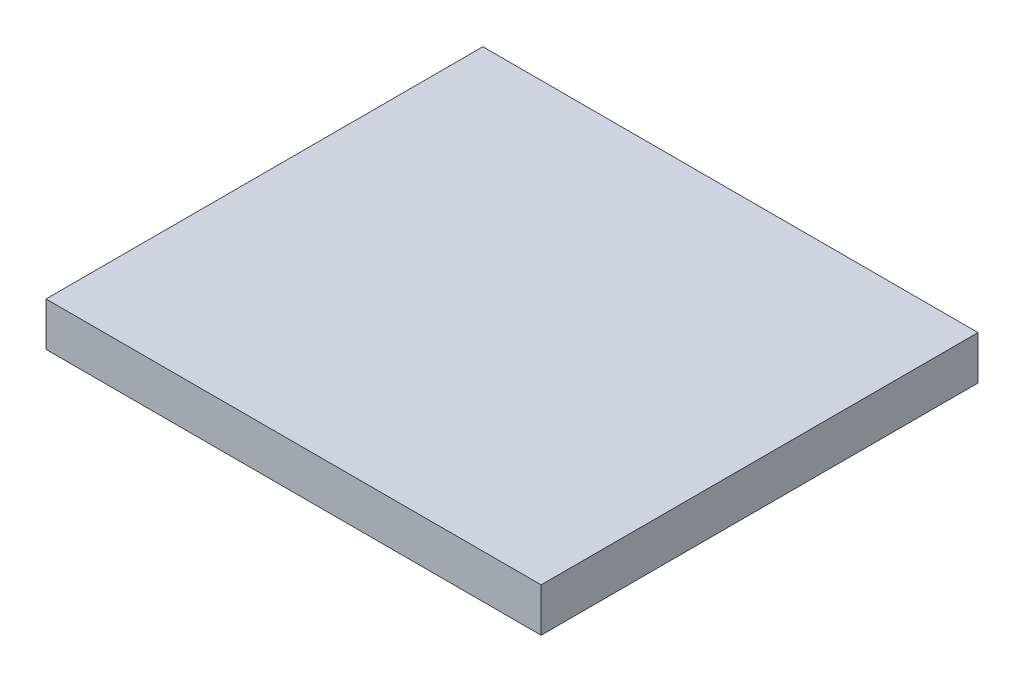
ISO-10303-21;
HEADER;
FILE_DESCRIPTION(('STEP AP214'),'2;1');
FILE_NAME('part.step','',(''),(''),'','','');
FILE_SCHEMA(('AUTOMOTIVE_DESIGN { 1 0 10303 214 1 1 1 1 }'));
ENDSEC;
DATA;
#1=APPLICATION_CONTEXT('core data for automotive mechanical design processes');
#2=APPLICATION_PROTOCOL_DEFINITION('international standard','automotive_design',2000,#1);
#3=PRODUCT_CONTEXT('',#1,'mechanical');
#4=PRODUCT('Part','Part','',(#3));
#5=PRODUCT_RELATED_PRODUCT_CATEGORY('part','',(#4));
#6=PRODUCT_DEFINITION_FORMATION('','',#4);
#7=PRODUCT_DEFINITION_CONTEXT('part definition',#1,'design');
#8=PRODUCT_DEFINITION('design','',#6,#7);
#9=PRODUCT_DEFINITION_SHAPE('','',#8);
#10=(LENGTH_UNIT() NAMED_UNIT(*) SI_UNIT(.MILLI.,.METRE.));
#11=(NAMED_UNIT(*) PLANE_ANGLE_UNIT() SI_UNIT($,.RADIAN.));
#12=(NAMED_UNIT(*) SI_UNIT($,.STERADIAN.) SOLID_ANGLE_UNIT());
#13=UNCERTAINTY_MEASURE_WITH_UNIT(LENGTH_MEASURE(1.E-05),#10,'distance_accuracy_value','');
#14=(GEOMETRIC_REPRESENTATION_CONTEXT(3) GLOBAL_UNCERTAINTY_ASSIGNED_CONTEXT((#13)) GLOBAL_UNIT_ASSIGNED_CONTEXT((#10,
#11,#12)) REPRESENTATION_CONTEXT('',''));
#15=CARTESIAN_POINT('',(0.,0.,0.));
#16=DIRECTION('',(0.,0.,1.));
#17=DIRECTION('',(1.,0.,0.));
#18=AXIS2_PLACEMENT_3D('',#15,#16,#17);
#19=CARTESIAN_POINT('',(-39.1379310344828,4.69827586206897,150.));
#20=DIRECTION('',(1.,0.,0.));
#21=DIRECTION('',(0.,0.,-1.));
#22=AXIS2_PLACEMENT_3D('',#19,#20,#21);
#23=PLANE('',#22);
#24=DIRECTION('',(0.,-1.,0.));
#25=VECTOR('',#24,1.);
#26=CARTESIAN_POINT('',(-39.1379310344828,4.69827586206897,0.));
#27=LINE('',#26,#25);
#28=CARTESIAN_POINT('',(-39.1379310344828,4.69827586206897,0.));
#29=VERTEX_POINT('',#28);
#30=CARTESIAN_POINT('',(-39.1379310344828,-10.301724137931,0.));
#31=VERTEX_POINT('',#30);
#32=EDGE_CURVE('E101',#29,#31,#27,.T.);
#33=ORIENTED_EDGE('',*,*,#32,.T.);
#34=DIRECTION('',(0.,0.,-1.));
#35=VECTOR('',#34,1.);
#36=CARTESIAN_POINT('',(-39.1379310344828,-10.301724137931,150.));
#37=LINE('',#36,#35);
#38=CARTESIAN_POINT('',(-39.1379310344828,-10.301724137931,150.));
#39=VERTEX_POINT('',#38);
#40=EDGE_CURVE('E11',#39,#31,#37,.T.);
#41=ORIENTED_EDGE('',*,*,#40,.F.);
#42=DIRECTION('',(0.,-1.,0.));
#43=VECTOR('',#42,1.);
#44=CARTESIAN_POINT('',(-39.1379310344828,4.69827586206897,150.));
#45=LINE('',#44,#43);
#46=CARTESIAN_POINT('',(-39.1379310344828,4.69827586206897,150.));
#47=VERTEX_POINT('',#46);
#48=EDGE_CURVE('E89',#47,#39,#45,.T.);
#49=ORIENTED_EDGE('',*,*,#48,.F.);
#50=DIRECTION('',(0.,0.,-1.));
#51=VECTOR('',#50,1.);
#52=CARTESIAN_POINT('',(-39.1379310344828,4.69827586206897,150.));
#53=LINE('',#52,#51);
#54=EDGE_CURVE('E97',#47,#29,#53,.T.);
#55=ORIENTED_EDGE('',*,*,#54,.T.);
#56=EDGE_LOOP('',(#33,#41,#49,#55));
#57=FACE_BOUND('',#56,.T.);
#58=ADVANCED_FACE('F38',(#57),#23,.F.);
#59=CARTESIAN_POINT('',(-39.1379310344828,-10.301724137931,150.));
#60=DIRECTION('',(0.,1.,0.));
#61=DIRECTION('',(0.,0.,1.));
#62=AXIS2_PLACEMENT_3D('',#59,#60,#61);
#63=PLANE('',#62);
#64=DIRECTION('',(1.,0.,0.));
#65=VECTOR('',#64,1.);
#66=CARTESIAN_POINT('',(-39.1379310344828,-10.301724137931,0.));
#67=LINE('',#66,#65);
#68=CARTESIAN_POINT('',(130.862068965517,-10.301724137931,0.));
#69=VERTEX_POINT('',#68);
#70=EDGE_CURVE('E93',#31,#69,#67,.T.);
#71=ORIENTED_EDGE('',*,*,#70,.T.);
#72=DIRECTION('',(0.,0.,-1.));
#73=VECTOR('',#72,1.);
#74=CARTESIAN_POINT('',(130.862068965517,-10.301724137931,150.));
#75=LINE('',#74,#73);
#76=CARTESIAN_POINT('',(130.862068965517,-10.301724137931,150.));
#77=VERTEX_POINT('',#76);
#78=EDGE_CURVE('E46',#77,#69,#75,.T.);
#79=ORIENTED_EDGE('',*,*,#78,.F.);
#80=DIRECTION('',(1.,0.,0.));
#81=VECTOR('',#80,1.);
#82=CARTESIAN_POINT('',(-39.1379310344828,-10.301724137931,150.));
#83=LINE('',#82,#81);
#84=EDGE_CURVE('E84',#39,#77,#83,.T.);
#85=ORIENTED_EDGE('',*,*,#84,.F.);
#86=ORIENTED_EDGE('',*,*,#40,.T.);
#87=EDGE_LOOP('',(#71,#79,#85,#86));
#88=FACE_BOUND('',#87,.T.);
#89=ADVANCED_FACE('F92',(#88),#63,.F.);
#90=CARTESIAN_POINT('',(130.862068965517,4.69827586206897,150.));
#91=DIRECTION('',(-1.,0.,0.));
#92=DIRECTION('',(0.,0.,1.));
#93=AXIS2_PLACEMENT_3D('',#90,#91,#92);
#94=PLANE('',#93);
#95=DIRECTION('',(0.,1.,0.));
#96=VECTOR('',#95,1.);
#97=CARTESIAN_POINT('',(130.862068965517,4.69827586206897,0.));
#98=LINE('',#97,#96);
#99=CARTESIAN_POINT('',(130.862068965517,4.69827586206897,0.));
#100=VERTEX_POINT('',#99);
#101=EDGE_CURVE('E71',#69,#100,#98,.T.);
#102=ORIENTED_EDGE('',*,*,#101,.T.);
#103=DIRECTION('',(0.,0.,-1.));
#104=VECTOR('',#103,1.);
#105=CARTESIAN_POINT('',(130.862068965517,4.69827586206897,150.));
#106=LINE('',#105,#104);
#107=CARTESIAN_POINT('',(130.862068965517,4.69827586206897,150.));
#108=VERTEX_POINT('',#107);
#109=EDGE_CURVE('E94',#108,#100,#106,.T.);
#110=ORIENTED_EDGE('',*,*,#109,.F.);
#111=DIRECTION('',(0.,1.,0.));
#112=VECTOR('',#111,1.);
#113=CARTESIAN_POINT('',(130.862068965517,4.69827586206897,150.));
#114=LINE('',#113,#112);
#115=EDGE_CURVE('E87',#77,#108,#114,.T.);
#116=ORIENTED_EDGE('',*,*,#115,.F.);
#117=ORIENTED_EDGE('',*,*,#78,.T.);
#118=EDGE_LOOP('',(#102,#110,#116,#117));
#119=FACE_BOUND('',#118,.T.);
#120=ADVANCED_FACE('F95',(#119),#94,.F.);
#121=CARTESIAN_POINT('',(-39.1379310344828,4.69827586206897,150.));
#122=DIRECTION('',(0.,-1.,0.));
#123=DIRECTION('',(0.,0.,-1.));
#124=AXIS2_PLACEMENT_3D('',#121,#122,#123);
#125=PLANE('',#124);
#126=DIRECTION('',(-1.,0.,0.));
#127=VECTOR('',#126,1.);
#128=CARTESIAN_POINT('',(-39.1379310344828,4.69827586206897,0.));
#129=LINE('',#128,#127);
#130=EDGE_CURVE('E77',#100,#29,#129,.T.);
#131=ORIENTED_EDGE('',*,*,#130,.T.);
#132=ORIENTED_EDGE('',*,*,#54,.F.);
#133=DIRECTION('',(-1.,0.,0.));
#134=VECTOR('',#133,1.);
#135=CARTESIAN_POINT('',(-39.1379310344828,4.69827586206897,150.));
#136=LINE('',#135,#134);
#137=EDGE_CURVE('E54',#108,#47,#136,.T.);
#138=ORIENTED_EDGE('',*,*,#137,.F.);
#139=ORIENTED_EDGE('',*,*,#109,.T.);
#140=EDGE_LOOP('',(#131,#132,#138,#139));
#141=FACE_BOUND('',#140,.T.);
#142=ADVANCED_FACE('F108',(#141),#125,.F.);
#143=CARTESIAN_POINT('',(0.,0.,150.));
#144=DIRECTION('',(0.,0.,1.));
#145=DIRECTION('',(1.,0.,0.));
#146=AXIS2_PLACEMENT_3D('',#143,#144,#145);
#147=PLANE('',#146);
#148=ORIENTED_EDGE('',*,*,#48,.T.);
#149=ORIENTED_EDGE('',*,*,#84,.T.);
#150=ORIENTED_EDGE('',*,*,#115,.T.);
#151=ORIENTED_EDGE('',*,*,#137,.T.);
#152=EDGE_LOOP('',(#148,#149,#150,#151));
#153=FACE_BOUND('',#152,.T.);
#154=ADVANCED_FACE('F85',(#153),#147,.T.);
#155=CARTESIAN_POINT('',(0.,0.,0.));
#156=DIRECTION('',(0.,0.,1.));
#157=DIRECTION('',(1.,0.,0.));
#158=AXIS2_PLACEMENT_3D('',#155,#156,#157);
#159=PLANE('',#158);
#160=ORIENTED_EDGE('',*,*,#32,.F.);
#161=ORIENTED_EDGE('',*,*,#130,.F.);
#162=ORIENTED_EDGE('',*,*,#101,.F.);
#163=ORIENTED_EDGE('',*,*,#70,.F.);
#164=EDGE_LOOP('',(#160,#161,#162,#163));
#165=FACE_BOUND('',#164,.T.);
#166=ADVANCED_FACE('F111',(#165),#159,.F.);
#167=CLOSED_SHELL('',(#58,#89,#120,#142,#154,#166));
#168=MANIFOLD_SOLID_BREP('B2',#167);
#169=ADVANCED_BREP_SHAPE_REPRESENTATION('',(#18,#168),#14);
#170=SHAPE_DEFINITION_REPRESENTATION(#9,#169);
ENDSEC;
END-ISO-10303-21;
